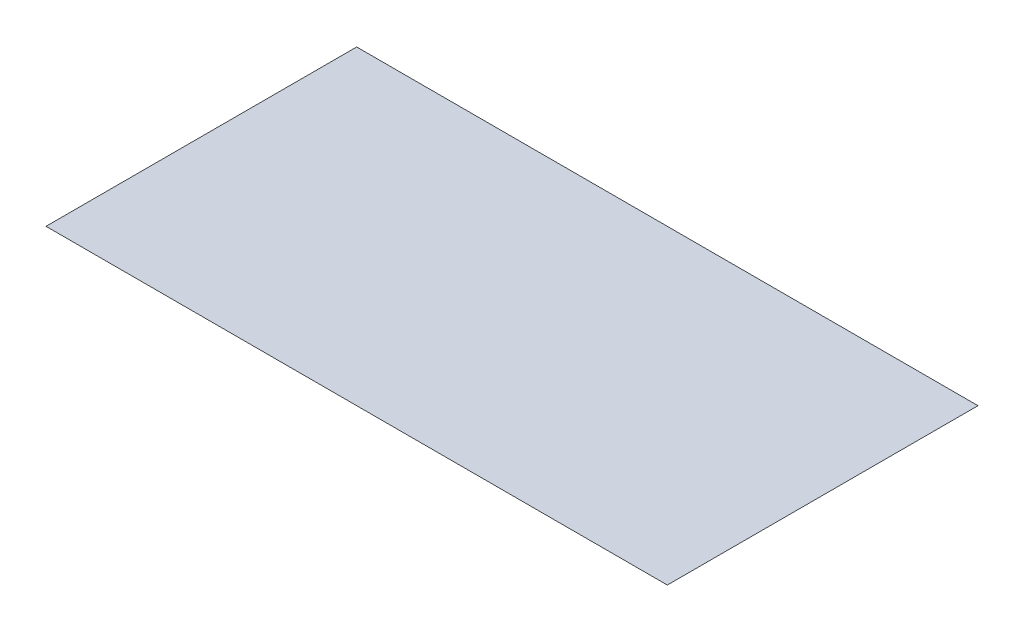
ISO-10303-21;
HEADER;
FILE_DESCRIPTION(('STEP AP214'),'2;1');
FILE_NAME('part.step','',(''),(''),'','','');
FILE_SCHEMA(('AUTOMOTIVE_DESIGN { 1 0 10303 214 1 1 1 1 }'));
ENDSEC;
DATA;
#1=APPLICATION_CONTEXT('core data for automotive mechanical design processes');
#2=APPLICATION_PROTOCOL_DEFINITION('international standard','automotive_design',2000,#1);
#3=PRODUCT_CONTEXT('',#1,'mechanical');
#4=PRODUCT('Part','Part','',(#3));
#5=PRODUCT_RELATED_PRODUCT_CATEGORY('part','',(#4));
#6=PRODUCT_DEFINITION_FORMATION('','',#4);
#7=PRODUCT_DEFINITION_CONTEXT('part definition',#1,'design');
#8=PRODUCT_DEFINITION('design','',#6,#7);
#9=PRODUCT_DEFINITION_SHAPE('','',#8);
#10=(LENGTH_UNIT() NAMED_UNIT(*) SI_UNIT(.MILLI.,.METRE.));
#11=(NAMED_UNIT(*) PLANE_ANGLE_UNIT() SI_UNIT($,.RADIAN.));
#12=(NAMED_UNIT(*) SI_UNIT($,.STERADIAN.) SOLID_ANGLE_UNIT());
#13=UNCERTAINTY_MEASURE_WITH_UNIT(LENGTH_MEASURE(1.E-05),#10,'distance_accuracy_value','');
#14=(GEOMETRIC_REPRESENTATION_CONTEXT(3) GLOBAL_UNCERTAINTY_ASSIGNED_CONTEXT((#13)) GLOBAL_UNIT_ASSIGNED_CONTEXT((#10,
#11,#12)) REPRESENTATION_CONTEXT('',''));
#15=CARTESIAN_POINT('',(0.,0.,0.));
#16=DIRECTION('',(0.,0.,1.));
#17=DIRECTION('',(1.,0.,0.));
#18=AXIS2_PLACEMENT_3D('',#15,#16,#17);
#19=CARTESIAN_POINT('',(-287.209839167455,2.54E-05,-154.851087984863));
#20=DIRECTION('',(1.,0.,0.));
#21=DIRECTION('',(0.,0.,-1.));
#22=AXIS2_PLACEMENT_3D('',#19,#20,#21);
#23=PLANE('',#22);
#24=DIRECTION('',(0.,0.,1.));
#25=VECTOR('',#24,1.);
#26=CARTESIAN_POINT('',(-287.209839167455,0.,-154.851087984863));
#27=LINE('',#26,#25);
#28=CARTESIAN_POINT('',(-287.209839167455,0.,-154.851087984863));
#29=VERTEX_POINT('',#28);
#30=CARTESIAN_POINT('',(-287.209839167455,0.,149.948912015137));
#31=VERTEX_POINT('',#30);
#32=EDGE_CURVE('E97',#29,#31,#27,.T.);
#33=ORIENTED_EDGE('',*,*,#32,.T.);
#34=DIRECTION('',(0.,-1.,0.));
#35=VECTOR('',#34,1.);
#36=CARTESIAN_POINT('',(-287.209839167455,2.54E-05,149.948912015137));
#37=LINE('',#36,#35);
#38=CARTESIAN_POINT('',(-287.209839167455,2.54E-05,149.948912015137));
#39=VERTEX_POINT('',#38);
#40=EDGE_CURVE('E11',#39,#31,#37,.T.);
#41=ORIENTED_EDGE('',*,*,#40,.F.);
#42=DIRECTION('',(0.,0.,1.));
#43=VECTOR('',#42,1.);
#44=CARTESIAN_POINT('',(-287.209839167455,2.54E-05,-154.851087984863));
#45=LINE('',#44,#43);
#46=CARTESIAN_POINT('',(-287.209839167455,2.54E-05,-154.851087984863));
#47=VERTEX_POINT('',#46);
#48=EDGE_CURVE('E85',#47,#39,#45,.T.);
#49=ORIENTED_EDGE('',*,*,#48,.F.);
#50=DIRECTION('',(0.,-1.,0.));
#51=VECTOR('',#50,1.);
#52=CARTESIAN_POINT('',(-287.209839167455,2.54E-05,-154.851087984863));
#53=LINE('',#52,#51);
#54=EDGE_CURVE('E93',#47,#29,#53,.T.);
#55=ORIENTED_EDGE('',*,*,#54,.T.);
#56=EDGE_LOOP('',(#33,#41,#49,#55));
#57=FACE_BOUND('',#56,.T.);
#58=ADVANCED_FACE('F34',(#57),#23,.F.);
#59=CARTESIAN_POINT('',(-287.209839167455,2.54E-05,149.948912015137));
#60=DIRECTION('',(0.,0.,-1.));
#61=DIRECTION('',(-1.,0.,0.));
#62=AXIS2_PLACEMENT_3D('',#59,#60,#61);
#63=PLANE('',#62);
#64=DIRECTION('',(1.,0.,0.));
#65=VECTOR('',#64,1.);
#66=CARTESIAN_POINT('',(-287.209839167455,0.,149.948912015137));
#67=LINE('',#66,#65);
#68=CARTESIAN_POINT('',(322.390160832545,0.,149.948912015137));
#69=VERTEX_POINT('',#68);
#70=EDGE_CURVE('E89',#31,#69,#67,.T.);
#71=ORIENTED_EDGE('',*,*,#70,.T.);
#72=DIRECTION('',(0.,-1.,0.));
#73=VECTOR('',#72,1.);
#74=CARTESIAN_POINT('',(322.390160832545,2.54E-05,149.948912015137));
#75=LINE('',#74,#73);
#76=CARTESIAN_POINT('',(322.390160832545,2.54E-05,149.948912015137));
#77=VERTEX_POINT('',#76);
#78=EDGE_CURVE('E42',#77,#69,#75,.T.);
#79=ORIENTED_EDGE('',*,*,#78,.F.);
#80=DIRECTION('',(1.,0.,0.));
#81=VECTOR('',#80,1.);
#82=CARTESIAN_POINT('',(-287.209839167455,2.54E-05,149.948912015137));
#83=LINE('',#82,#81);
#84=EDGE_CURVE('E80',#39,#77,#83,.T.);
#85=ORIENTED_EDGE('',*,*,#84,.F.);
#86=ORIENTED_EDGE('',*,*,#40,.T.);
#87=EDGE_LOOP('',(#71,#79,#85,#86));
#88=FACE_BOUND('',#87,.T.);
#89=ADVANCED_FACE('F88',(#88),#63,.F.);
#90=CARTESIAN_POINT('',(322.390160832545,2.54E-05,-154.851087984863));
#91=DIRECTION('',(-1.,0.,0.));
#92=DIRECTION('',(0.,0.,1.));
#93=AXIS2_PLACEMENT_3D('',#90,#91,#92);
#94=PLANE('',#93);
#95=DIRECTION('',(0.,0.,-1.));
#96=VECTOR('',#95,1.);
#97=CARTESIAN_POINT('',(322.390160832545,0.,-154.851087984863));
#98=LINE('',#97,#96);
#99=CARTESIAN_POINT('',(322.390160832545,0.,-154.851087984863));
#100=VERTEX_POINT('',#99);
#101=EDGE_CURVE('E67',#69,#100,#98,.T.);
#102=ORIENTED_EDGE('',*,*,#101,.T.);
#103=DIRECTION('',(0.,-1.,0.));
#104=VECTOR('',#103,1.);
#105=CARTESIAN_POINT('',(322.390160832545,2.54E-05,-154.851087984863));
#106=LINE('',#105,#104);
#107=CARTESIAN_POINT('',(322.390160832545,2.54E-05,-154.851087984863));
#108=VERTEX_POINT('',#107);
#109=EDGE_CURVE('E90',#108,#100,#106,.T.);
#110=ORIENTED_EDGE('',*,*,#109,.F.);
#111=DIRECTION('',(0.,0.,-1.));
#112=VECTOR('',#111,1.);
#113=CARTESIAN_POINT('',(322.390160832545,2.54E-05,-154.851087984863));
#114=LINE('',#113,#112);
#115=EDGE_CURVE('E83',#77,#108,#114,.T.);
#116=ORIENTED_EDGE('',*,*,#115,.F.);
#117=ORIENTED_EDGE('',*,*,#78,.T.);
#118=EDGE_LOOP('',(#102,#110,#116,#117));
#119=FACE_BOUND('',#118,.T.);
#120=ADVANCED_FACE('F91',(#119),#94,.F.);
#121=CARTESIAN_POINT('',(-287.209839167455,2.54E-05,-154.851087984863));
#122=DIRECTION('',(0.,0.,1.));
#123=DIRECTION('',(1.,0.,0.));
#124=AXIS2_PLACEMENT_3D('',#121,#122,#123);
#125=PLANE('',#124);
#126=DIRECTION('',(-1.,0.,0.));
#127=VECTOR('',#126,1.);
#128=CARTESIAN_POINT('',(-287.209839167455,0.,-154.851087984863));
#129=LINE('',#128,#127);
#130=EDGE_CURVE('E73',#100,#29,#129,.T.);
#131=ORIENTED_EDGE('',*,*,#130,.T.);
#132=ORIENTED_EDGE('',*,*,#54,.F.);
#133=DIRECTION('',(-1.,0.,0.));
#134=VECTOR('',#133,1.);
#135=CARTESIAN_POINT('',(-287.209839167455,2.54E-05,-154.851087984863));
#136=LINE('',#135,#134);
#137=EDGE_CURVE('E50',#108,#47,#136,.T.);
#138=ORIENTED_EDGE('',*,*,#137,.F.);
#139=ORIENTED_EDGE('',*,*,#109,.T.);
#140=EDGE_LOOP('',(#131,#132,#138,#139));
#141=FACE_BOUND('',#140,.T.);
#142=ADVANCED_FACE('F104',(#141),#125,.F.);
#143=CARTESIAN_POINT('',(0.,2.54E-05,0.));
#144=DIRECTION('',(0.,1.,0.));
#145=DIRECTION('',(0.,0.,1.));
#146=AXIS2_PLACEMENT_3D('',#143,#144,#145);
#147=PLANE('',#146);
#148=ORIENTED_EDGE('',*,*,#48,.T.);
#149=ORIENTED_EDGE('',*,*,#84,.T.);
#150=ORIENTED_EDGE('',*,*,#115,.T.);
#151=ORIENTED_EDGE('',*,*,#137,.T.);
#152=EDGE_LOOP('',(#148,#149,#150,#151));
#153=FACE_BOUND('',#152,.T.);
#154=ADVANCED_FACE('F81',(#153),#147,.T.);
#155=CARTESIAN_POINT('',(0.,0.,0.));
#156=DIRECTION('',(0.,1.,0.));
#157=DIRECTION('',(0.,0.,1.));
#158=AXIS2_PLACEMENT_3D('',#155,#156,#157);
#159=PLANE('',#158);
#160=ORIENTED_EDGE('',*,*,#32,.F.);
#161=ORIENTED_EDGE('',*,*,#130,.F.);
#162=ORIENTED_EDGE('',*,*,#101,.F.);
#163=ORIENTED_EDGE('',*,*,#70,.F.);
#164=EDGE_LOOP('',(#160,#161,#162,#163));
#165=FACE_BOUND('',#164,.T.);
#166=ADVANCED_FACE('F107',(#165),#159,.F.);
#167=CLOSED_SHELL('',(#58,#89,#120,#142,#154,#166));
#168=MANIFOLD_SOLID_BREP('B2',#167);
#169=ADVANCED_BREP_SHAPE_REPRESENTATION('',(#18,#168),#14);
#170=SHAPE_DEFINITION_REPRESENTATION(#9,#169);
ENDSEC;
END-ISO-10303-21;
